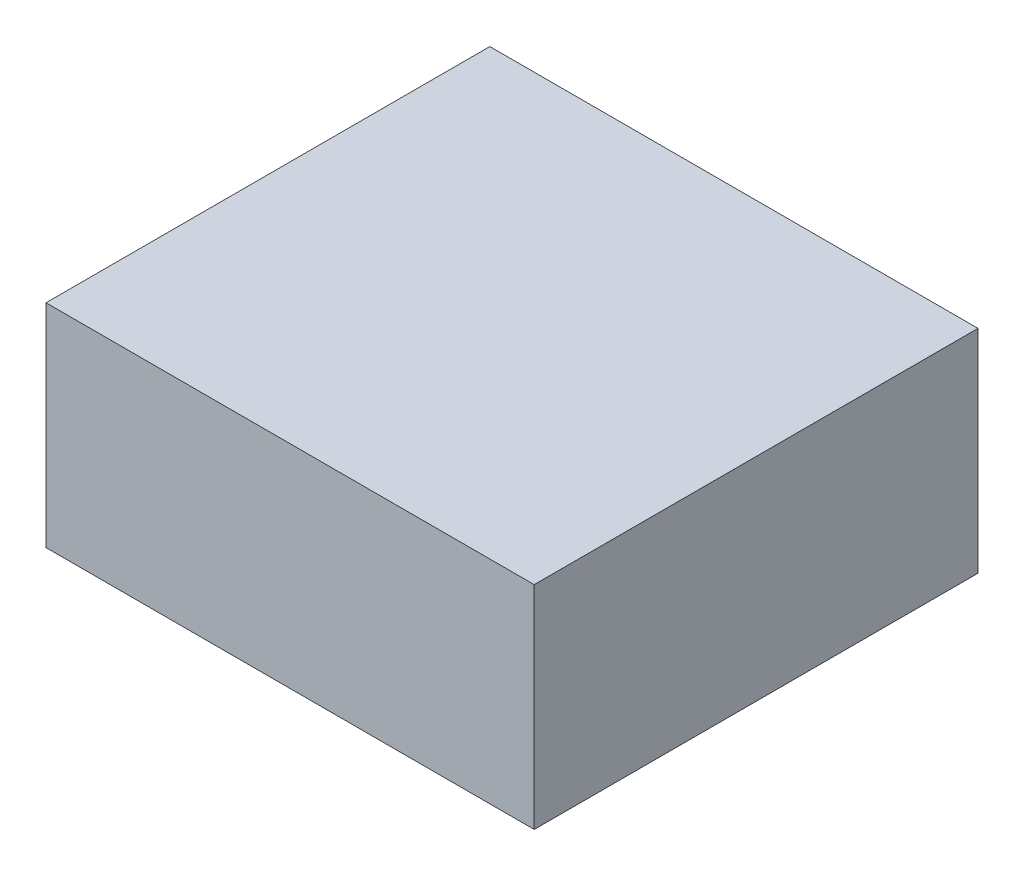
ISO-10303-21;
HEADER;
FILE_DESCRIPTION(('STEP AP214'),'2;1');
FILE_NAME('part.step','',(''),(''),'','','');
FILE_SCHEMA(('AUTOMOTIVE_DESIGN { 1 0 10303 214 1 1 1 1 }'));
ENDSEC;
DATA;
#1=APPLICATION_CONTEXT('core data for automotive mechanical design processes');
#2=APPLICATION_PROTOCOL_DEFINITION('international standard','automotive_design',2000,#1);
#3=PRODUCT_CONTEXT('',#1,'mechanical');
#4=PRODUCT('Part','Part','',(#3));
#5=PRODUCT_RELATED_PRODUCT_CATEGORY('part','',(#4));
#6=PRODUCT_DEFINITION_FORMATION('','',#4);
#7=PRODUCT_DEFINITION_CONTEXT('part definition',#1,'design');
#8=PRODUCT_DEFINITION('design','',#6,#7);
#9=PRODUCT_DEFINITION_SHAPE('','',#8);
#10=(LENGTH_UNIT() NAMED_UNIT(*) SI_UNIT(.MILLI.,.METRE.));
#11=(NAMED_UNIT(*) PLANE_ANGLE_UNIT() SI_UNIT($,.RADIAN.));
#12=(NAMED_UNIT(*) SI_UNIT($,.STERADIAN.) SOLID_ANGLE_UNIT());
#13=UNCERTAINTY_MEASURE_WITH_UNIT(LENGTH_MEASURE(1.E-05),#10,'distance_accuracy_value','');
#14=(GEOMETRIC_REPRESENTATION_CONTEXT(3) GLOBAL_UNCERTAINTY_ASSIGNED_CONTEXT((#13)) GLOBAL_UNIT_ASSIGNED_CONTEXT((#10,
#11,#12)) REPRESENTATION_CONTEXT('',''));
#15=CARTESIAN_POINT('',(0.,0.,0.));
#16=DIRECTION('',(0.,0.,1.));
#17=DIRECTION('',(1.,0.,0.));
#18=AXIS2_PLACEMENT_3D('',#15,#16,#17);
#19=CARTESIAN_POINT('',(-9.14309919900874,-7.54642357765197,2.4));
#20=DIRECTION('',(0.,1.,0.));
#21=DIRECTION('',(0.,0.,1.));
#22=AXIS2_PLACEMENT_3D('',#19,#20,#21);
#23=PLANE('',#22);
#24=DIRECTION('',(0.,0.,1.));
#25=VECTOR('',#24,1.);
#26=CARTESIAN_POINT('',(-9.14309919900874,-7.54642357765197,2.4));
#27=LINE('',#26,#25);
#28=CARTESIAN_POINT('',(-9.14309919900874,-7.54642357765197,2.4));
#29=VERTEX_POINT('',#28);
#30=CARTESIAN_POINT('',(-9.14309919900874,-7.54642357765197,3.30000000000001));
#31=VERTEX_POINT('',#30);
#32=EDGE_CURVE('E11',#29,#31,#27,.T.);
#33=ORIENTED_EDGE('',*,*,#32,.T.);
#34=DIRECTION('',(1.,0.,0.));
#35=VECTOR('',#34,1.);
#36=CARTESIAN_POINT('',(-9.14309919900874,-7.54642357765197,3.30000000000001));
#37=LINE('',#36,#35);
#38=CARTESIAN_POINT('',(-8.15309919900874,-7.54642357765197,3.30000000000001));
#39=VERTEX_POINT('',#38);
#40=EDGE_CURVE('E24',#31,#39,#37,.T.);
#41=ORIENTED_EDGE('',*,*,#40,.T.);
#42=DIRECTION('',(0.,0.,-1.));
#43=VECTOR('',#42,1.);
#44=CARTESIAN_POINT('',(-8.15309919900874,-7.54642357765197,2.4));
#45=LINE('',#44,#43);
#46=CARTESIAN_POINT('',(-8.15309919900874,-7.54642357765197,2.4));
#47=VERTEX_POINT('',#46);
#48=EDGE_CURVE('E88',#39,#47,#45,.T.);
#49=ORIENTED_EDGE('',*,*,#48,.T.);
#50=DIRECTION('',(-1.,0.,0.));
#51=VECTOR('',#50,1.);
#52=CARTESIAN_POINT('',(-9.14309919900874,-7.54642357765197,2.4));
#53=LINE('',#52,#51);
#54=EDGE_CURVE('E69',#47,#29,#53,.T.);
#55=ORIENTED_EDGE('',*,*,#54,.T.);
#56=EDGE_LOOP('',(#33,#41,#49,#55));
#57=FACE_BOUND('',#56,.T.);
#58=ADVANCED_FACE('F17',(#57),#23,.T.);
#59=CARTESIAN_POINT('',(-8.64809919900874,-7.97642357765197,3.30000000000001));
#60=DIRECTION('',(0.,0.,1.));
#61=DIRECTION('',(0.,-1.,0.));
#62=AXIS2_PLACEMENT_3D('',#59,#60,#61);
#63=PLANE('',#62);
#64=DIRECTION('',(1.,0.,0.));
#65=VECTOR('',#64,1.);
#66=CARTESIAN_POINT('',(-8.64809919900874,-7.97642357765197,3.30000000000001));
#67=LINE('',#66,#65);
#68=CARTESIAN_POINT('',(-9.14309919900874,-7.97642357765197,3.30000000000001));
#69=VERTEX_POINT('',#68);
#70=CARTESIAN_POINT('',(-8.15309919900874,-7.97642357765197,3.30000000000001));
#71=VERTEX_POINT('',#70);
#72=EDGE_CURVE('E85',#69,#71,#67,.T.);
#73=ORIENTED_EDGE('',*,*,#72,.T.);
#74=DIRECTION('',(0.,1.,0.));
#75=VECTOR('',#74,1.);
#76=CARTESIAN_POINT('',(-8.15309919900874,-7.97642357765197,3.30000000000001));
#77=LINE('',#76,#75);
#78=EDGE_CURVE('E76',#71,#39,#77,.T.);
#79=ORIENTED_EDGE('',*,*,#78,.T.);
#80=ORIENTED_EDGE('',*,*,#40,.F.);
#81=DIRECTION('',(0.,-1.,0.));
#82=VECTOR('',#81,1.);
#83=CARTESIAN_POINT('',(-9.14309919900874,-7.97642357765197,3.30000000000001));
#84=LINE('',#83,#82);
#85=EDGE_CURVE('E81',#31,#69,#84,.T.);
#86=ORIENTED_EDGE('',*,*,#85,.T.);
#87=EDGE_LOOP('',(#73,#79,#80,#86));
#88=FACE_BOUND('',#87,.T.);
#89=ADVANCED_FACE('F90',(#88),#63,.T.);
#90=CARTESIAN_POINT('',(-9.14309919900874,-7.97642357765197,2.85000000000001));
#91=DIRECTION('',(-1.,0.,0.));
#92=DIRECTION('',(0.,0.,1.));
#93=AXIS2_PLACEMENT_3D('',#90,#91,#92);
#94=PLANE('',#93);
#95=DIRECTION('',(0.,0.,1.));
#96=VECTOR('',#95,1.);
#97=CARTESIAN_POINT('',(-9.14309919900874,-7.97642357765197,2.85000000000001));
#98=LINE('',#97,#96);
#99=CARTESIAN_POINT('',(-9.14309919900874,-7.97642357765197,2.4));
#100=VERTEX_POINT('',#99);
#101=EDGE_CURVE('E60',#100,#69,#98,.T.);
#102=ORIENTED_EDGE('',*,*,#101,.T.);
#103=ORIENTED_EDGE('',*,*,#85,.F.);
#104=ORIENTED_EDGE('',*,*,#32,.F.);
#105=DIRECTION('',(0.,-1.,0.));
#106=VECTOR('',#105,1.);
#107=CARTESIAN_POINT('',(-9.14309919900874,-7.97642357765197,2.4));
#108=LINE('',#107,#106);
#109=EDGE_CURVE('E63',#29,#100,#108,.T.);
#110=ORIENTED_EDGE('',*,*,#109,.T.);
#111=EDGE_LOOP('',(#102,#103,#104,#110));
#112=FACE_BOUND('',#111,.T.);
#113=ADVANCED_FACE('F91',(#112),#94,.T.);
#114=CARTESIAN_POINT('',(-8.64809919900874,-7.97642357765197,2.4));
#115=DIRECTION('',(0.,0.,-1.));
#116=DIRECTION('',(0.,1.,0.));
#117=AXIS2_PLACEMENT_3D('',#114,#115,#116);
#118=PLANE('',#117);
#119=DIRECTION('',(-1.,0.,0.));
#120=VECTOR('',#119,1.);
#121=CARTESIAN_POINT('',(-8.64809919900874,-7.97642357765197,2.4));
#122=LINE('',#121,#120);
#123=CARTESIAN_POINT('',(-8.15309919900874,-7.97642357765197,2.4));
#124=VERTEX_POINT('',#123);
#125=EDGE_CURVE('E54',#124,#100,#122,.T.);
#126=ORIENTED_EDGE('',*,*,#125,.T.);
#127=ORIENTED_EDGE('',*,*,#109,.F.);
#128=ORIENTED_EDGE('',*,*,#54,.F.);
#129=DIRECTION('',(0.,-1.,0.));
#130=VECTOR('',#129,1.);
#131=CARTESIAN_POINT('',(-8.15309919900874,-7.97642357765197,2.4));
#132=LINE('',#131,#130);
#133=EDGE_CURVE('E64',#47,#124,#132,.T.);
#134=ORIENTED_EDGE('',*,*,#133,.T.);
#135=EDGE_LOOP('',(#126,#127,#128,#134));
#136=FACE_BOUND('',#135,.T.);
#137=ADVANCED_FACE('F68',(#136),#118,.T.);
#138=CARTESIAN_POINT('',(-8.15309919900874,-7.97642357765197,2.85000000000001));
#139=DIRECTION('',(1.,0.,0.));
#140=DIRECTION('',(0.,0.,-1.));
#141=AXIS2_PLACEMENT_3D('',#138,#139,#140);
#142=PLANE('',#141);
#143=DIRECTION('',(0.,0.,-1.));
#144=VECTOR('',#143,1.);
#145=CARTESIAN_POINT('',(-8.15309919900874,-7.97642357765197,2.85000000000001));
#146=LINE('',#145,#144);
#147=EDGE_CURVE('E58',#71,#124,#146,.T.);
#148=ORIENTED_EDGE('',*,*,#147,.T.);
#149=ORIENTED_EDGE('',*,*,#133,.F.);
#150=ORIENTED_EDGE('',*,*,#48,.F.);
#151=ORIENTED_EDGE('',*,*,#78,.F.);
#152=EDGE_LOOP('',(#148,#149,#150,#151));
#153=FACE_BOUND('',#152,.T.);
#154=ADVANCED_FACE('F74',(#153),#142,.T.);
#155=CARTESIAN_POINT('',(-8.64809919900874,-7.97642357765197,2.85000000000001));
#156=DIRECTION('',(0.,1.,0.));
#157=DIRECTION('',(0.,0.,1.));
#158=AXIS2_PLACEMENT_3D('',#155,#156,#157);
#159=PLANE('',#158);
#160=ORIENTED_EDGE('',*,*,#147,.F.);
#161=ORIENTED_EDGE('',*,*,#72,.F.);
#162=ORIENTED_EDGE('',*,*,#101,.F.);
#163=ORIENTED_EDGE('',*,*,#125,.F.);
#164=EDGE_LOOP('',(#160,#161,#162,#163));
#165=FACE_BOUND('',#164,.T.);
#166=ADVANCED_FACE('F56',(#165),#159,.F.);
#167=CLOSED_SHELL('',(#58,#89,#113,#137,#154,#166));
#168=MANIFOLD_SOLID_BREP('B1',#167);
#169=ADVANCED_BREP_SHAPE_REPRESENTATION('',(#18,#168),#14);
#170=SHAPE_DEFINITION_REPRESENTATION(#9,#169);
ENDSEC;
END-ISO-10303-21;
